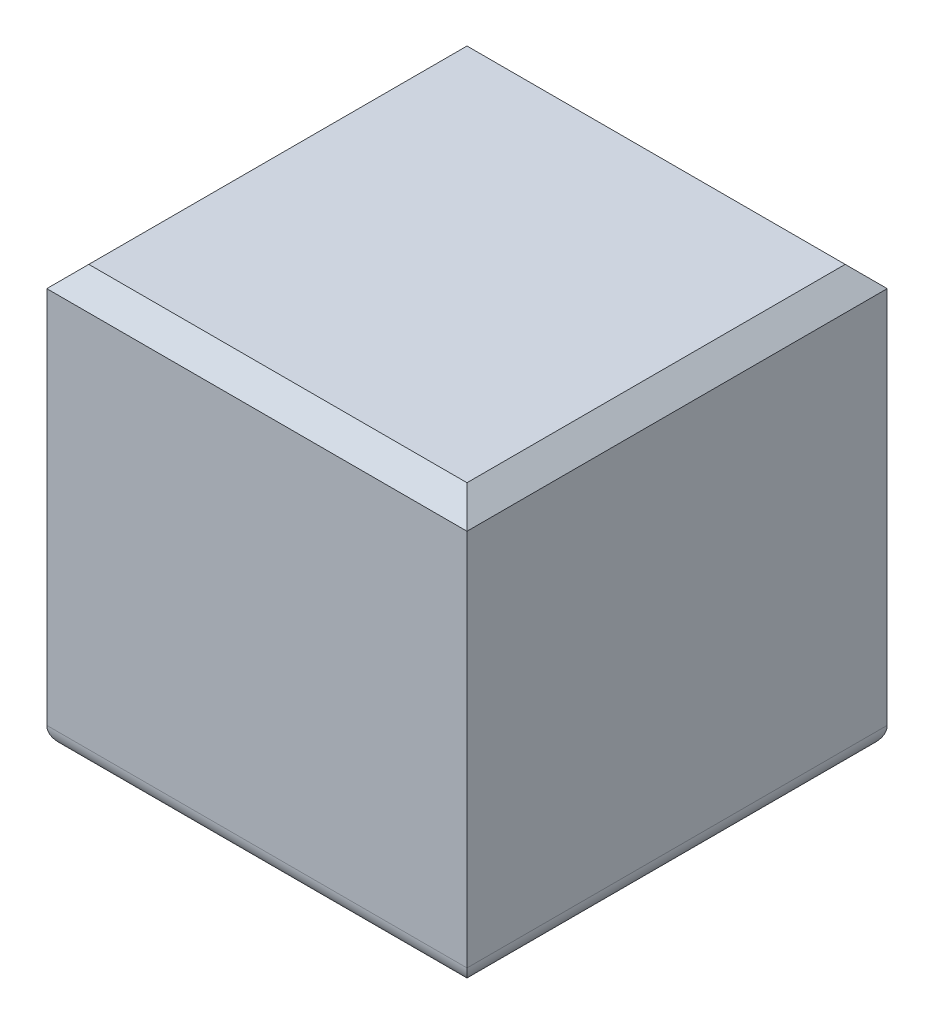
ISO-10303-21;
HEADER;
FILE_DESCRIPTION(('STEP AP214'),'2;1');
FILE_NAME('part.step','',(''),(''),'','','');
FILE_SCHEMA(('AUTOMOTIVE_DESIGN { 1 0 10303 214 1 1 1 1 }'));
ENDSEC;
DATA;
#1=APPLICATION_CONTEXT('core data for automotive mechanical design processes');
#2=APPLICATION_PROTOCOL_DEFINITION('international standard','automotive_design',2000,#1);
#3=PRODUCT_CONTEXT('',#1,'mechanical');
#4=PRODUCT('Part','Part','',(#3));
#5=PRODUCT_RELATED_PRODUCT_CATEGORY('part','',(#4));
#6=PRODUCT_DEFINITION_FORMATION('','',#4);
#7=PRODUCT_DEFINITION_CONTEXT('part definition',#1,'design');
#8=PRODUCT_DEFINITION('design','',#6,#7);
#9=PRODUCT_DEFINITION_SHAPE('','',#8);
#10=(LENGTH_UNIT() NAMED_UNIT(*) SI_UNIT(.MILLI.,.METRE.));
#11=(NAMED_UNIT(*) PLANE_ANGLE_UNIT() SI_UNIT($,.RADIAN.));
#12=(NAMED_UNIT(*) SI_UNIT($,.STERADIAN.) SOLID_ANGLE_UNIT());
#13=UNCERTAINTY_MEASURE_WITH_UNIT(LENGTH_MEASURE(1.E-05),#10,'distance_accuracy_value','');
#14=(GEOMETRIC_REPRESENTATION_CONTEXT(3) GLOBAL_UNCERTAINTY_ASSIGNED_CONTEXT((#13)) GLOBAL_UNIT_ASSIGNED_CONTEXT((#10,
#11,#12)) REPRESENTATION_CONTEXT('',''));
#15=CARTESIAN_POINT('',(0.,0.,0.));
#16=DIRECTION('',(0.,0.,1.));
#17=DIRECTION('',(1.,0.,0.));
#18=AXIS2_PLACEMENT_3D('',#15,#16,#17);
#19=CARTESIAN_POINT('',(45.,5.,50.));
#20=DIRECTION('',(0.,0.,-1.));
#21=DIRECTION('',(-1.,0.,0.));
#22=AXIS2_PLACEMENT_3D('',#19,#20,#21);
#23=CYLINDRICAL_SURFACE('',#22,5.);
#24=CARTESIAN_POINT('',(45.,5.,-45.));
#25=DIRECTION('',(-0.707106781186548,0.,-0.707106781186547));
#26=DIRECTION('',(-0.707106781186547,0.,0.707106781186548));
#27=AXIS2_PLACEMENT_3D('',#24,#25,#26);
#28=ELLIPSE('',#27,7.07106781186548,5.);
#29=CARTESIAN_POINT('',(50.,5.,-50.));
#30=VERTEX_POINT('',#29);
#31=CARTESIAN_POINT('',(45.,0.,-45.));
#32=VERTEX_POINT('',#31);
#33=EDGE_CURVE('E155',#30,#32,#28,.T.);
#34=ORIENTED_EDGE('',*,*,#33,.F.);
#35=DIRECTION('',(0.,0.,-1.));
#36=VECTOR('',#35,1.);
#37=CARTESIAN_POINT('',(50.,5.,50.));
#38=LINE('',#37,#36);
#39=CARTESIAN_POINT('',(50.,5.,50.));
#40=VERTEX_POINT('',#39);
#41=EDGE_CURVE('E123',#40,#30,#38,.T.);
#42=ORIENTED_EDGE('',*,*,#41,.F.);
#43=CARTESIAN_POINT('',(45.,5.,45.));
#44=DIRECTION('',(0.707106781186547,0.,-0.707106781186548));
#45=DIRECTION('',(-0.707106781186548,0.,-0.707106781186547));
#46=AXIS2_PLACEMENT_3D('',#43,#44,#45);
#47=ELLIPSE('',#46,7.07106781186547,5.);
#48=CARTESIAN_POINT('',(45.,0.,45.));
#49=VERTEX_POINT('',#48);
#50=EDGE_CURVE('E153',#40,#49,#47,.T.);
#51=ORIENTED_EDGE('',*,*,#50,.T.);
#52=DIRECTION('',(0.,0.,-1.));
#53=VECTOR('',#52,1.);
#54=CARTESIAN_POINT('',(45.,0.,0.));
#55=LINE('',#54,#53);
#56=EDGE_CURVE('E133',#32,#49,#55,.F.);
#57=ORIENTED_EDGE('',*,*,#56,.F.);
#58=EDGE_LOOP('',(#34,#42,#51,#57));
#59=FACE_BOUND('',#58,.T.);
#60=ADVANCED_FACE('F37',(#59),#23,.T.);
#61=CARTESIAN_POINT('',(50.,5.,45.));
#62=DIRECTION('',(1.,0.,0.));
#63=DIRECTION('',(0.,0.,-1.));
#64=AXIS2_PLACEMENT_3D('',#61,#62,#63);
#65=CYLINDRICAL_SURFACE('',#64,5.);
#66=ORIENTED_EDGE('',*,*,#50,.F.);
#67=DIRECTION('',(1.,0.,0.));
#68=VECTOR('',#67,1.);
#69=CARTESIAN_POINT('',(50.,5.,50.));
#70=LINE('',#69,#68);
#71=CARTESIAN_POINT('',(-50.,5.,50.));
#72=VERTEX_POINT('',#71);
#73=EDGE_CURVE('E128',#72,#40,#70,.T.);
#74=ORIENTED_EDGE('',*,*,#73,.F.);
#75=CARTESIAN_POINT('',(-45.,5.,45.));
#76=DIRECTION('',(0.707106781186548,0.,0.707106781186547));
#77=DIRECTION('',(0.707106781186547,0.,-0.707106781186548));
#78=AXIS2_PLACEMENT_3D('',#75,#76,#77);
#79=ELLIPSE('',#78,7.07106781186548,5.);
#80=CARTESIAN_POINT('',(-45.,0.,45.));
#81=VERTEX_POINT('',#80);
#82=EDGE_CURVE('E122',#72,#81,#79,.T.);
#83=ORIENTED_EDGE('',*,*,#82,.T.);
#84=DIRECTION('',(1.,0.,0.));
#85=VECTOR('',#84,1.);
#86=CARTESIAN_POINT('',(0.,0.,45.));
#87=LINE('',#86,#85);
#88=EDGE_CURVE('E137',#49,#81,#87,.F.);
#89=ORIENTED_EDGE('',*,*,#88,.F.);
#90=EDGE_LOOP('',(#66,#74,#83,#89));
#91=FACE_BOUND('',#90,.T.);
#92=ADVANCED_FACE('F210',(#91),#65,.T.);
#93=CARTESIAN_POINT('',(-45.,5.,50.));
#94=DIRECTION('',(0.,0.,1.));
#95=DIRECTION('',(1.,0.,0.));
#96=AXIS2_PLACEMENT_3D('',#93,#94,#95);
#97=CYLINDRICAL_SURFACE('',#96,5.);
#98=ORIENTED_EDGE('',*,*,#82,.F.);
#99=DIRECTION('',(0.,0.,1.));
#100=VECTOR('',#99,1.);
#101=CARTESIAN_POINT('',(-50.,5.,50.));
#102=LINE('',#101,#100);
#103=CARTESIAN_POINT('',(-50.,5.,-50.));
#104=VERTEX_POINT('',#103);
#105=EDGE_CURVE('E105',#104,#72,#102,.T.);
#106=ORIENTED_EDGE('',*,*,#105,.F.);
#107=CARTESIAN_POINT('',(-45.,5.,-45.));
#108=DIRECTION('',(-0.707106781186547,0.,0.707106781186548));
#109=DIRECTION('',(0.707106781186548,0.,0.707106781186547));
#110=AXIS2_PLACEMENT_3D('',#107,#108,#109);
#111=ELLIPSE('',#110,7.07106781186547,5.);
#112=CARTESIAN_POINT('',(-45.,0.,-45.));
#113=VERTEX_POINT('',#112);
#114=EDGE_CURVE('E114',#104,#113,#111,.T.);
#115=ORIENTED_EDGE('',*,*,#114,.T.);
#116=DIRECTION('',(0.,0.,1.));
#117=VECTOR('',#116,1.);
#118=CARTESIAN_POINT('',(-45.,0.,0.));
#119=LINE('',#118,#117);
#120=EDGE_CURVE('E145',#81,#113,#119,.F.);
#121=ORIENTED_EDGE('',*,*,#120,.F.);
#122=EDGE_LOOP('',(#98,#106,#115,#121));
#123=FACE_BOUND('',#122,.T.);
#124=ADVANCED_FACE('F126',(#123),#97,.T.);
#125=CARTESIAN_POINT('',(50.,5.,-45.));
#126=DIRECTION('',(-1.,0.,0.));
#127=DIRECTION('',(0.,0.,1.));
#128=AXIS2_PLACEMENT_3D('',#125,#126,#127);
#129=CYLINDRICAL_SURFACE('',#128,5.);
#130=DIRECTION('',(-1.,0.,0.));
#131=VECTOR('',#130,1.);
#132=CARTESIAN_POINT('',(50.,5.,-50.));
#133=LINE('',#132,#131);
#134=EDGE_CURVE('E116',#30,#104,#133,.T.);
#135=ORIENTED_EDGE('',*,*,#134,.F.);
#136=ORIENTED_EDGE('',*,*,#33,.T.);
#137=DIRECTION('',(-1.,0.,0.));
#138=VECTOR('',#137,1.);
#139=CARTESIAN_POINT('',(0.,0.,-45.));
#140=LINE('',#139,#138);
#141=EDGE_CURVE('E118',#113,#32,#140,.F.);
#142=ORIENTED_EDGE('',*,*,#141,.F.);
#143=ORIENTED_EDGE('',*,*,#114,.F.);
#144=EDGE_LOOP('',(#135,#136,#142,#143));
#145=FACE_BOUND('',#144,.T.);
#146=ADVANCED_FACE('F115',(#145),#129,.T.);
#147=CARTESIAN_POINT('',(-50.,100.,50.));
#148=DIRECTION('',(1.,0.,0.));
#149=DIRECTION('',(0.,0.,-1.));
#150=AXIS2_PLACEMENT_3D('',#147,#148,#149);
#151=PLANE('',#150);
#152=DIRECTION('',(0.,-1.,0.));
#153=VECTOR('',#152,1.);
#154=CARTESIAN_POINT('',(-50.,100.,50.));
#155=LINE('',#154,#153);
#156=CARTESIAN_POINT('',(-50.,95.,50.));
#157=VERTEX_POINT('',#156);
#158=EDGE_CURVE('E134',#157,#72,#155,.T.);
#159=ORIENTED_EDGE('',*,*,#158,.F.);
#160=DIRECTION('',(0.,0.,-1.));
#161=VECTOR('',#160,1.);
#162=CARTESIAN_POINT('',(-50.,95.,-50.));
#163=LINE('',#162,#161);
#164=CARTESIAN_POINT('',(-50.,95.,-50.));
#165=VERTEX_POINT('',#164);
#166=EDGE_CURVE('E46',#157,#165,#163,.T.);
#167=ORIENTED_EDGE('',*,*,#166,.T.);
#168=DIRECTION('',(0.,-1.,0.));
#169=VECTOR('',#168,1.);
#170=CARTESIAN_POINT('',(-50.,100.,-50.));
#171=LINE('',#170,#169);
#172=EDGE_CURVE('E101',#165,#104,#171,.T.);
#173=ORIENTED_EDGE('',*,*,#172,.T.);
#174=ORIENTED_EDGE('',*,*,#105,.T.);
#175=EDGE_LOOP('',(#159,#167,#173,#174));
#176=FACE_BOUND('',#175,.T.);
#177=ADVANCED_FACE('F103',(#176),#151,.F.);
#178=CARTESIAN_POINT('',(50.,100.,50.));
#179=DIRECTION('',(0.,0.,-1.));
#180=DIRECTION('',(-1.,0.,0.));
#181=AXIS2_PLACEMENT_3D('',#178,#179,#180);
#182=PLANE('',#181);
#183=DIRECTION('',(0.,-1.,0.));
#184=VECTOR('',#183,1.);
#185=CARTESIAN_POINT('',(50.,100.,50.));
#186=LINE('',#185,#184);
#187=CARTESIAN_POINT('',(50.,95.,50.));
#188=VERTEX_POINT('',#187);
#189=EDGE_CURVE('E139',#188,#40,#186,.T.);
#190=ORIENTED_EDGE('',*,*,#189,.F.);
#191=DIRECTION('',(-1.,0.,0.));
#192=VECTOR('',#191,1.);
#193=CARTESIAN_POINT('',(-50.,95.,50.));
#194=LINE('',#193,#192);
#195=EDGE_CURVE('E61',#188,#157,#194,.T.);
#196=ORIENTED_EDGE('',*,*,#195,.T.);
#197=ORIENTED_EDGE('',*,*,#158,.T.);
#198=ORIENTED_EDGE('',*,*,#73,.T.);
#199=EDGE_LOOP('',(#190,#196,#197,#198));
#200=FACE_BOUND('',#199,.T.);
#201=ADVANCED_FACE('F250',(#200),#182,.F.);
#202=CARTESIAN_POINT('',(50.,100.,50.));
#203=DIRECTION('',(-1.,0.,0.));
#204=DIRECTION('',(0.,0.,1.));
#205=AXIS2_PLACEMENT_3D('',#202,#203,#204);
#206=PLANE('',#205);
#207=DIRECTION('',(0.,-1.,0.));
#208=VECTOR('',#207,1.);
#209=CARTESIAN_POINT('',(50.,100.,-50.));
#210=LINE('',#209,#208);
#211=CARTESIAN_POINT('',(50.,95.,-50.));
#212=VERTEX_POINT('',#211);
#213=EDGE_CURVE('E109',#212,#30,#210,.T.);
#214=ORIENTED_EDGE('',*,*,#213,.F.);
#215=DIRECTION('',(0.,0.,1.));
#216=VECTOR('',#215,1.);
#217=CARTESIAN_POINT('',(50.,95.,50.));
#218=LINE('',#217,#216);
#219=EDGE_CURVE('E166',#212,#188,#218,.T.);
#220=ORIENTED_EDGE('',*,*,#219,.T.);
#221=ORIENTED_EDGE('',*,*,#189,.T.);
#222=ORIENTED_EDGE('',*,*,#41,.T.);
#223=EDGE_LOOP('',(#214,#220,#221,#222));
#224=FACE_BOUND('',#223,.T.);
#225=ADVANCED_FACE('F191',(#224),#206,.F.);
#226=CARTESIAN_POINT('',(50.,100.,-50.));
#227=DIRECTION('',(0.,0.,1.));
#228=DIRECTION('',(1.,0.,0.));
#229=AXIS2_PLACEMENT_3D('',#226,#227,#228);
#230=PLANE('',#229);
#231=ORIENTED_EDGE('',*,*,#172,.F.);
#232=DIRECTION('',(1.,0.,0.));
#233=VECTOR('',#232,1.);
#234=CARTESIAN_POINT('',(50.,95.,-50.));
#235=LINE('',#234,#233);
#236=EDGE_CURVE('E11',#165,#212,#235,.T.);
#237=ORIENTED_EDGE('',*,*,#236,.T.);
#238=ORIENTED_EDGE('',*,*,#213,.T.);
#239=ORIENTED_EDGE('',*,*,#134,.T.);
#240=EDGE_LOOP('',(#231,#237,#238,#239));
#241=FACE_BOUND('',#240,.T.);
#242=ADVANCED_FACE('F130',(#241),#230,.F.);
#243=CARTESIAN_POINT('',(0.,100.,0.));
#244=DIRECTION('',(0.,1.,0.));
#245=DIRECTION('',(0.,0.,1.));
#246=AXIS2_PLACEMENT_3D('',#243,#244,#245);
#247=PLANE('',#246);
#248=DIRECTION('',(1.,0.,0.));
#249=VECTOR('',#248,1.);
#250=CARTESIAN_POINT('',(50.,100.,45.));
#251=LINE('',#250,#249);
#252=CARTESIAN_POINT('',(-45.,100.,45.));
#253=VERTEX_POINT('',#252);
#254=CARTESIAN_POINT('',(45.,100.,45.));
#255=VERTEX_POINT('',#254);
#256=EDGE_CURVE('E161',#253,#255,#251,.T.);
#257=ORIENTED_EDGE('',*,*,#256,.T.);
#258=DIRECTION('',(0.,0.,-1.));
#259=VECTOR('',#258,1.);
#260=CARTESIAN_POINT('',(45.,100.,-50.));
#261=LINE('',#260,#259);
#262=CARTESIAN_POINT('',(45.,100.,-45.));
#263=VERTEX_POINT('',#262);
#264=EDGE_CURVE('E163',#255,#263,#261,.T.);
#265=ORIENTED_EDGE('',*,*,#264,.T.);
#266=DIRECTION('',(-1.,0.,0.));
#267=VECTOR('',#266,1.);
#268=CARTESIAN_POINT('',(-50.,100.,-45.));
#269=LINE('',#268,#267);
#270=CARTESIAN_POINT('',(-45.,100.,-45.));
#271=VERTEX_POINT('',#270);
#272=EDGE_CURVE('E157',#263,#271,#269,.T.);
#273=ORIENTED_EDGE('',*,*,#272,.T.);
#274=DIRECTION('',(0.,0.,1.));
#275=VECTOR('',#274,1.);
#276=CARTESIAN_POINT('',(-45.,100.,50.));
#277=LINE('',#276,#275);
#278=EDGE_CURVE('E159',#271,#253,#277,.T.);
#279=ORIENTED_EDGE('',*,*,#278,.T.);
#280=EDGE_LOOP('',(#257,#265,#273,#279));
#281=FACE_BOUND('',#280,.T.);
#282=ADVANCED_FACE('F198',(#281),#247,.T.);
#283=CARTESIAN_POINT('',(0.,0.,0.));
#284=DIRECTION('',(0.,1.,0.));
#285=DIRECTION('',(0.,0.,1.));
#286=AXIS2_PLACEMENT_3D('',#283,#284,#285);
#287=PLANE('',#286);
#288=ORIENTED_EDGE('',*,*,#120,.T.);
#289=ORIENTED_EDGE('',*,*,#141,.T.);
#290=ORIENTED_EDGE('',*,*,#56,.T.);
#291=ORIENTED_EDGE('',*,*,#88,.T.);
#292=EDGE_LOOP('',(#288,#289,#290,#291));
#293=FACE_BOUND('',#292,.T.);
#294=ADVANCED_FACE('F200',(#293),#287,.F.);
#295=CARTESIAN_POINT('',(-45.,100.,0.));
#296=DIRECTION('',(-0.707106781186549,0.707106781186545,0.));
#297=DIRECTION('',(0.,0.,-1.));
#298=AXIS2_PLACEMENT_3D('',#295,#296,#297);
#299=PLANE('',#298);
#300=DIRECTION('',(0.577350269189625,0.577350269189628,0.577350269189625));
#301=VECTOR('',#300,1.);
#302=CARTESIAN_POINT('',(-30.,115.,-30.0000000000001));
#303=LINE('',#302,#301);
#304=EDGE_CURVE('E174',#165,#271,#303,.T.);
#305=ORIENTED_EDGE('',*,*,#304,.F.);
#306=ORIENTED_EDGE('',*,*,#166,.F.);
#307=DIRECTION('',(0.577350269189625,0.577350269189628,-0.577350269189625));
#308=VECTOR('',#307,1.);
#309=CARTESIAN_POINT('',(-30.0000000000001,115.,30.));
#310=LINE('',#309,#308);
#311=EDGE_CURVE('E41',#253,#157,#310,.F.);
#312=ORIENTED_EDGE('',*,*,#311,.F.);
#313=ORIENTED_EDGE('',*,*,#278,.F.);
#314=EDGE_LOOP('',(#305,#306,#312,#313));
#315=FACE_BOUND('',#314,.T.);
#316=ADVANCED_FACE('F39',(#315),#299,.T.);
#317=CARTESIAN_POINT('',(0.,100.,45.));
#318=DIRECTION('',(0.,0.707106781186545,0.707106781186549));
#319=DIRECTION('',(-1.,0.,0.));
#320=AXIS2_PLACEMENT_3D('',#317,#318,#319);
#321=PLANE('',#320);
#322=ORIENTED_EDGE('',*,*,#311,.T.);
#323=ORIENTED_EDGE('',*,*,#195,.F.);
#324=DIRECTION('',(-0.577350269189625,0.577350269189628,-0.577350269189625));
#325=VECTOR('',#324,1.);
#326=CARTESIAN_POINT('',(30.,115.,30.));
#327=LINE('',#326,#325);
#328=EDGE_CURVE('E173',#255,#188,#327,.F.);
#329=ORIENTED_EDGE('',*,*,#328,.F.);
#330=ORIENTED_EDGE('',*,*,#256,.F.);
#331=EDGE_LOOP('',(#322,#323,#329,#330));
#332=FACE_BOUND('',#331,.T.);
#333=ADVANCED_FACE('F183',(#332),#321,.T.);
#334=CARTESIAN_POINT('',(0.,100.,-45.));
#335=DIRECTION('',(0.,0.707106781186545,-0.707106781186549));
#336=DIRECTION('',(1.,0.,0.));
#337=AXIS2_PLACEMENT_3D('',#334,#335,#336);
#338=PLANE('',#337);
#339=ORIENTED_EDGE('',*,*,#304,.T.);
#340=ORIENTED_EDGE('',*,*,#272,.F.);
#341=DIRECTION('',(0.577350269189625,-0.577350269189628,-0.577350269189625));
#342=VECTOR('',#341,1.);
#343=CARTESIAN_POINT('',(30.,115.,-30.0000000000001));
#344=LINE('',#343,#342);
#345=EDGE_CURVE('E171',#212,#263,#344,.F.);
#346=ORIENTED_EDGE('',*,*,#345,.F.);
#347=ORIENTED_EDGE('',*,*,#236,.F.);
#348=EDGE_LOOP('',(#339,#340,#346,#347));
#349=FACE_BOUND('',#348,.T.);
#350=ADVANCED_FACE('F188',(#349),#338,.T.);
#351=CARTESIAN_POINT('',(45.,100.,0.));
#352=DIRECTION('',(0.707106781186549,0.707106781186545,0.));
#353=DIRECTION('',(0.,0.,1.));
#354=AXIS2_PLACEMENT_3D('',#351,#352,#353);
#355=PLANE('',#354);
#356=ORIENTED_EDGE('',*,*,#328,.T.);
#357=ORIENTED_EDGE('',*,*,#219,.F.);
#358=ORIENTED_EDGE('',*,*,#345,.T.);
#359=ORIENTED_EDGE('',*,*,#264,.F.);
#360=EDGE_LOOP('',(#356,#357,#358,#359));
#361=FACE_BOUND('',#360,.T.);
#362=ADVANCED_FACE('F195',(#361),#355,.T.);
#363=CLOSED_SHELL('',(#60,#92,#124,#146,#177,#201,#225,#242,#282,#294,#316,#333,#350,#362));
#364=MANIFOLD_SOLID_BREP('B2',#363);
#365=ADVANCED_BREP_SHAPE_REPRESENTATION('',(#18,#364),#14);
#366=SHAPE_DEFINITION_REPRESENTATION(#9,#365);
ENDSEC;
END-ISO-10303-21;
